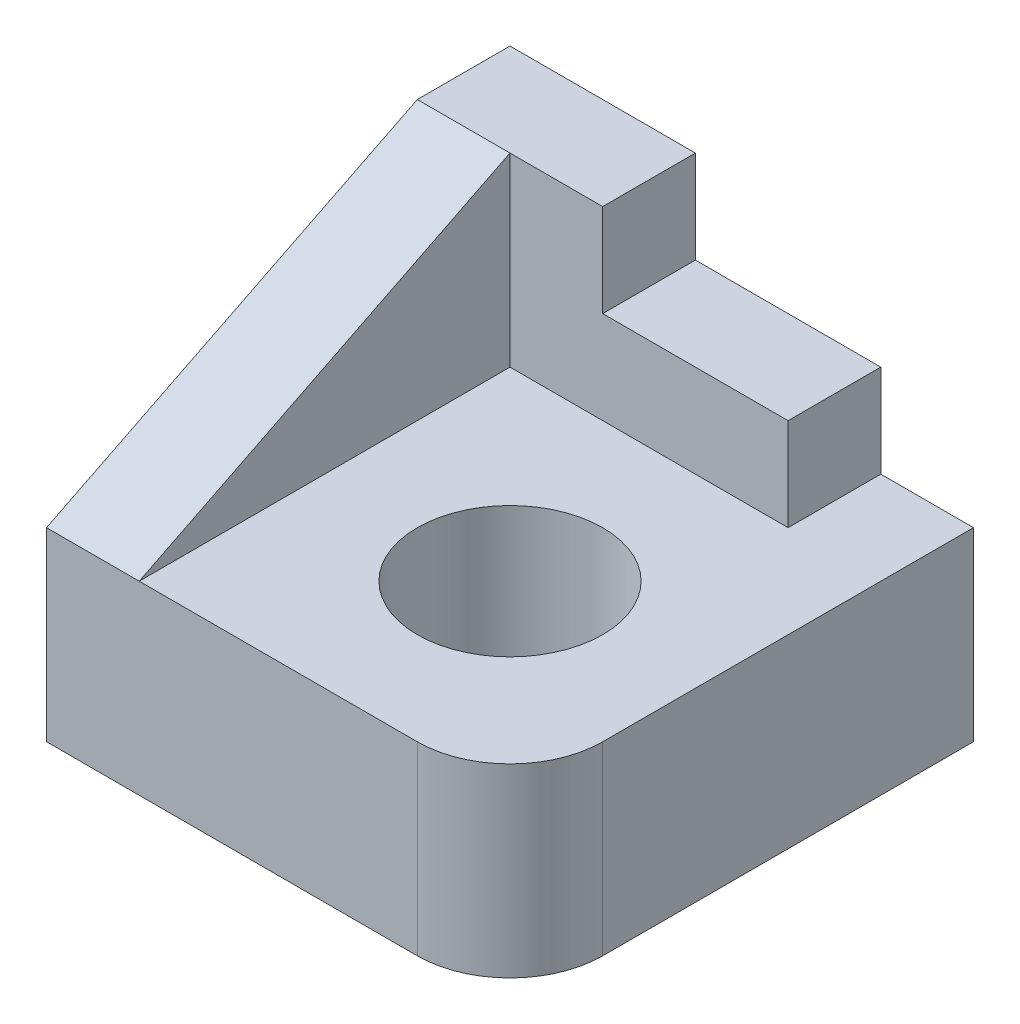
ISO-10303-21;
HEADER;
FILE_DESCRIPTION(('STEP AP214'),'2;1');
FILE_NAME('part.step','',(''),(''),'','','');
FILE_SCHEMA(('AUTOMOTIVE_DESIGN { 1 0 10303 214 1 1 1 1 }'));
ENDSEC;
DATA;
#1=APPLICATION_CONTEXT('core data for automotive mechanical design processes');
#2=APPLICATION_PROTOCOL_DEFINITION('international standard','automotive_design',2000,#1);
#3=PRODUCT_CONTEXT('',#1,'mechanical');
#4=PRODUCT('Part','Part','',(#3));
#5=PRODUCT_RELATED_PRODUCT_CATEGORY('part','',(#4));
#6=PRODUCT_DEFINITION_FORMATION('','',#4);
#7=PRODUCT_DEFINITION_CONTEXT('part definition',#1,'design');
#8=PRODUCT_DEFINITION('design','',#6,#7);
#9=PRODUCT_DEFINITION_SHAPE('','',#8);
#10=(LENGTH_UNIT() NAMED_UNIT(*) SI_UNIT(.MILLI.,.METRE.));
#11=(NAMED_UNIT(*) PLANE_ANGLE_UNIT() SI_UNIT($,.RADIAN.));
#12=(NAMED_UNIT(*) SI_UNIT($,.STERADIAN.) SOLID_ANGLE_UNIT());
#13=UNCERTAINTY_MEASURE_WITH_UNIT(LENGTH_MEASURE(1.E-05),#10,'distance_accuracy_value','');
#14=(GEOMETRIC_REPRESENTATION_CONTEXT(3) GLOBAL_UNCERTAINTY_ASSIGNED_CONTEXT((#13)) GLOBAL_UNIT_ASSIGNED_CONTEXT((#10,
#11,#12)) REPRESENTATION_CONTEXT('',''));
#15=CARTESIAN_POINT('',(0.,0.,0.));
#16=DIRECTION('',(0.,0.,1.));
#17=DIRECTION('',(1.,0.,0.));
#18=AXIS2_PLACEMENT_3D('',#15,#16,#17);
#19=CARTESIAN_POINT('',(20.,10.,20.));
#20=DIRECTION('',(0.,-1.,0.));
#21=DIRECTION('',(0.,0.,-1.));
#22=AXIS2_PLACEMENT_3D('',#19,#20,#21);
#23=PLANE('',#22);
#24=CARTESIAN_POINT('',(15.,10.,15.));
#25=DIRECTION('',(0.,1.,0.));
#26=DIRECTION('',(0.,0.,1.));
#27=AXIS2_PLACEMENT_3D('',#24,#25,#26);
#28=CIRCLE('',#27,5.);
#29=CARTESIAN_POINT('',(15.,10.,20.));
#30=VERTEX_POINT('',#29);
#31=EDGE_CURVE('E185',#30,#30,#28,.T.);
#32=ORIENTED_EDGE('',*,*,#31,.F.);
#33=EDGE_LOOP('',(#32));
#34=FACE_BOUND('',#33,.T.);
#35=DIRECTION('',(0.,0.,1.));
#36=VECTOR('',#35,1.);
#37=CARTESIAN_POINT('',(5.,10.,5.));
#38=LINE('',#37,#36);
#39=CARTESIAN_POINT('',(5.,10.,5.));
#40=VERTEX_POINT('',#39);
#41=CARTESIAN_POINT('',(5.,10.,25.));
#42=VERTEX_POINT('',#41);
#43=EDGE_CURVE('E131',#40,#42,#38,.T.);
#44=ORIENTED_EDGE('',*,*,#43,.T.);
#45=DIRECTION('',(1.,0.,0.));
#46=VECTOR('',#45,1.);
#47=CARTESIAN_POINT('',(0.,10.,25.));
#48=LINE('',#47,#46);
#49=CARTESIAN_POINT('',(20.,10.,25.));
#50=VERTEX_POINT('',#49);
#51=EDGE_CURVE('E85',#42,#50,#48,.T.);
#52=ORIENTED_EDGE('',*,*,#51,.T.);
#53=CARTESIAN_POINT('',(20.,10.,20.));
#54=DIRECTION('',(0.,1.,0.));
#55=DIRECTION('',(0.,0.,-1.));
#56=AXIS2_PLACEMENT_3D('',#53,#54,#55);
#57=CIRCLE('',#56,5.);
#58=CARTESIAN_POINT('',(25.,10.,20.));
#59=VERTEX_POINT('',#58);
#60=EDGE_CURVE('E192',#50,#59,#57,.T.);
#61=ORIENTED_EDGE('',*,*,#60,.T.);
#62=DIRECTION('',(0.,0.,-1.));
#63=VECTOR('',#62,1.);
#64=CARTESIAN_POINT('',(25.,10.,0.));
#65=LINE('',#64,#63);
#66=CARTESIAN_POINT('',(25.,10.,0.));
#67=VERTEX_POINT('',#66);
#68=EDGE_CURVE('E56',#59,#67,#65,.T.);
#69=ORIENTED_EDGE('',*,*,#68,.T.);
#70=DIRECTION('',(-1.,0.,0.));
#71=VECTOR('',#70,1.);
#72=CARTESIAN_POINT('',(0.,10.,0.));
#73=LINE('',#72,#71);
#74=CARTESIAN_POINT('',(20.,10.,0.));
#75=VERTEX_POINT('',#74);
#76=EDGE_CURVE('E50',#67,#75,#73,.T.);
#77=ORIENTED_EDGE('',*,*,#76,.T.);
#78=DIRECTION('',(0.,0.,-1.));
#79=VECTOR('',#78,1.);
#80=CARTESIAN_POINT('',(20.,10.,5.));
#81=LINE('',#80,#79);
#82=CARTESIAN_POINT('',(20.,10.,5.));
#83=VERTEX_POINT('',#82);
#84=EDGE_CURVE('E182',#83,#75,#81,.T.);
#85=ORIENTED_EDGE('',*,*,#84,.F.);
#86=DIRECTION('',(1.,0.,0.));
#87=VECTOR('',#86,1.);
#88=CARTESIAN_POINT('',(0.,10.,5.));
#89=LINE('',#88,#87);
#90=EDGE_CURVE('E154',#40,#83,#89,.T.);
#91=ORIENTED_EDGE('',*,*,#90,.F.);
#92=EDGE_LOOP('',(#44,#52,#61,#69,#77,#85,#91));
#93=FACE_BOUND('',#92,.T.);
#94=ADVANCED_FACE('F35',(#34,#93),#23,.F.);
#95=CARTESIAN_POINT('',(0.,0.,5.));
#96=DIRECTION('',(0.,0.,-1.));
#97=DIRECTION('',(-1.,0.,0.));
#98=AXIS2_PLACEMENT_3D('',#95,#96,#97);
#99=PLANE('',#98);
#100=DIRECTION('',(0.,-1.,0.));
#101=VECTOR('',#100,1.);
#102=CARTESIAN_POINT('',(5.,20.,5.));
#103=LINE('',#102,#101);
#104=CARTESIAN_POINT('',(5.,20.,5.));
#105=VERTEX_POINT('',#104);
#106=EDGE_CURVE('E127',#105,#40,#103,.T.);
#107=ORIENTED_EDGE('',*,*,#106,.T.);
#108=ORIENTED_EDGE('',*,*,#90,.T.);
#109=DIRECTION('',(0.,1.,0.));
#110=VECTOR('',#109,1.);
#111=CARTESIAN_POINT('',(20.,0.,5.));
#112=LINE('',#111,#110);
#113=CARTESIAN_POINT('',(20.,15.,5.));
#114=VERTEX_POINT('',#113);
#115=EDGE_CURVE('E234',#83,#114,#112,.T.);
#116=ORIENTED_EDGE('',*,*,#115,.T.);
#117=DIRECTION('',(1.,0.,0.));
#118=VECTOR('',#117,1.);
#119=CARTESIAN_POINT('',(0.,15.,5.));
#120=LINE('',#119,#118);
#121=CARTESIAN_POINT('',(10.,15.,5.));
#122=VERTEX_POINT('',#121);
#123=EDGE_CURVE('E235',#122,#114,#120,.T.);
#124=ORIENTED_EDGE('',*,*,#123,.F.);
#125=DIRECTION('',(0.,1.,0.));
#126=VECTOR('',#125,1.);
#127=CARTESIAN_POINT('',(10.,0.,5.));
#128=LINE('',#127,#126);
#129=CARTESIAN_POINT('',(10.,20.,5.));
#130=VERTEX_POINT('',#129);
#131=EDGE_CURVE('E151',#122,#130,#128,.T.);
#132=ORIENTED_EDGE('',*,*,#131,.T.);
#133=DIRECTION('',(1.,0.,0.));
#134=VECTOR('',#133,1.);
#135=CARTESIAN_POINT('',(0.,20.,5.));
#136=LINE('',#135,#134);
#137=EDGE_CURVE('E147',#105,#130,#136,.T.);
#138=ORIENTED_EDGE('',*,*,#137,.F.);
#139=EDGE_LOOP('',(#107,#108,#116,#124,#132,#138));
#140=FACE_BOUND('',#139,.T.);
#141=ADVANCED_FACE('F148',(#140),#99,.F.);
#142=CARTESIAN_POINT('',(20.,0.,20.));
#143=DIRECTION('',(0.,-1.,0.));
#144=DIRECTION('',(0.,0.,-1.));
#145=AXIS2_PLACEMENT_3D('',#142,#143,#144);
#146=PLANE('',#145);
#147=DIRECTION('',(0.,0.,1.));
#148=VECTOR('',#147,1.);
#149=CARTESIAN_POINT('',(0.,0.,0.));
#150=LINE('',#149,#148);
#151=CARTESIAN_POINT('',(0.,0.,0.));
#152=VERTEX_POINT('',#151);
#153=CARTESIAN_POINT('',(0.,0.,25.));
#154=VERTEX_POINT('',#153);
#155=EDGE_CURVE('E188',#152,#154,#150,.T.);
#156=ORIENTED_EDGE('',*,*,#155,.F.);
#157=DIRECTION('',(-1.,0.,0.));
#158=VECTOR('',#157,1.);
#159=CARTESIAN_POINT('',(0.,0.,0.));
#160=LINE('',#159,#158);
#161=CARTESIAN_POINT('',(25.,0.,0.));
#162=VERTEX_POINT('',#161);
#163=EDGE_CURVE('E80',#162,#152,#160,.T.);
#164=ORIENTED_EDGE('',*,*,#163,.F.);
#165=DIRECTION('',(0.,0.,-1.));
#166=VECTOR('',#165,1.);
#167=CARTESIAN_POINT('',(25.,0.,0.));
#168=LINE('',#167,#166);
#169=CARTESIAN_POINT('',(25.,0.,20.));
#170=VERTEX_POINT('',#169);
#171=EDGE_CURVE('E203',#170,#162,#168,.T.);
#172=ORIENTED_EDGE('',*,*,#171,.F.);
#173=CARTESIAN_POINT('',(20.,0.,20.));
#174=DIRECTION('',(0.,1.,0.));
#175=DIRECTION('',(0.,0.,-1.));
#176=AXIS2_PLACEMENT_3D('',#173,#174,#175);
#177=CIRCLE('',#176,5.);
#178=CARTESIAN_POINT('',(20.,0.,25.));
#179=VERTEX_POINT('',#178);
#180=EDGE_CURVE('E201',#179,#170,#177,.T.);
#181=ORIENTED_EDGE('',*,*,#180,.F.);
#182=DIRECTION('',(1.,0.,0.));
#183=VECTOR('',#182,1.);
#184=CARTESIAN_POINT('',(0.,0.,25.));
#185=LINE('',#184,#183);
#186=EDGE_CURVE('E199',#154,#179,#185,.T.);
#187=ORIENTED_EDGE('',*,*,#186,.F.);
#188=EDGE_LOOP('',(#156,#164,#172,#181,#187));
#189=FACE_BOUND('',#188,.T.);
#190=CARTESIAN_POINT('',(15.,0.,15.));
#191=DIRECTION('',(0.,1.,0.));
#192=DIRECTION('',(0.,0.,1.));
#193=AXIS2_PLACEMENT_3D('',#190,#191,#192);
#194=CIRCLE('',#193,5.);
#195=CARTESIAN_POINT('',(15.,0.,20.));
#196=VERTEX_POINT('',#195);
#197=EDGE_CURVE('E180',#196,#196,#194,.T.);
#198=ORIENTED_EDGE('',*,*,#197,.T.);
#199=EDGE_LOOP('',(#198));
#200=FACE_BOUND('',#199,.T.);
#201=ADVANCED_FACE('F221',(#189,#200),#146,.T.);
#202=CARTESIAN_POINT('',(0.,10.,0.));
#203=DIRECTION('',(1.,0.,0.));
#204=DIRECTION('',(0.,0.,-1.));
#205=AXIS2_PLACEMENT_3D('',#202,#203,#204);
#206=PLANE('',#205);
#207=DIRECTION('',(0.,-1.,0.));
#208=VECTOR('',#207,1.);
#209=CARTESIAN_POINT('',(0.,10.,25.));
#210=LINE('',#209,#208);
#211=CARTESIAN_POINT('',(0.,10.,25.));
#212=VERTEX_POINT('',#211);
#213=EDGE_CURVE('E11',#212,#154,#210,.T.);
#214=ORIENTED_EDGE('',*,*,#213,.F.);
#215=DIRECTION('',(0.,0.447213595499958,-0.894427190999916));
#216=VECTOR('',#215,1.);
#217=CARTESIAN_POINT('',(0.,10.,25.));
#218=LINE('',#217,#216);
#219=CARTESIAN_POINT('',(0.,20.,5.));
#220=VERTEX_POINT('',#219);
#221=EDGE_CURVE('E144',#212,#220,#218,.T.);
#222=ORIENTED_EDGE('',*,*,#221,.T.);
#223=DIRECTION('',(0.,0.,-1.));
#224=VECTOR('',#223,1.);
#225=CARTESIAN_POINT('',(0.,20.,5.));
#226=LINE('',#225,#224);
#227=CARTESIAN_POINT('',(0.,20.,0.));
#228=VERTEX_POINT('',#227);
#229=EDGE_CURVE('E159',#220,#228,#226,.T.);
#230=ORIENTED_EDGE('',*,*,#229,.T.);
#231=DIRECTION('',(0.,-1.,0.));
#232=VECTOR('',#231,1.);
#233=CARTESIAN_POINT('',(0.,10.,0.));
#234=LINE('',#233,#232);
#235=EDGE_CURVE('E196',#228,#152,#234,.T.);
#236=ORIENTED_EDGE('',*,*,#235,.T.);
#237=ORIENTED_EDGE('',*,*,#155,.T.);
#238=EDGE_LOOP('',(#214,#222,#230,#236,#237));
#239=FACE_BOUND('',#238,.T.);
#240=ADVANCED_FACE('F37',(#239),#206,.F.);
#241=CARTESIAN_POINT('',(0.,10.,25.));
#242=DIRECTION('',(0.,0.,-1.));
#243=DIRECTION('',(-1.,0.,0.));
#244=AXIS2_PLACEMENT_3D('',#241,#242,#243);
#245=PLANE('',#244);
#246=ORIENTED_EDGE('',*,*,#186,.T.);
#247=DIRECTION('',(0.,-1.,0.));
#248=VECTOR('',#247,1.);
#249=CARTESIAN_POINT('',(20.,10.,25.));
#250=LINE('',#249,#248);
#251=EDGE_CURVE('E43',#50,#179,#250,.T.);
#252=ORIENTED_EDGE('',*,*,#251,.F.);
#253=ORIENTED_EDGE('',*,*,#51,.F.);
#254=EDGE_CURVE('E143',#212,#42,#48,.T.);
#255=ORIENTED_EDGE('',*,*,#254,.F.);
#256=ORIENTED_EDGE('',*,*,#213,.T.);
#257=EDGE_LOOP('',(#246,#252,#253,#255,#256));
#258=FACE_BOUND('',#257,.T.);
#259=ADVANCED_FACE('F242',(#258),#245,.F.);
#260=CARTESIAN_POINT('',(20.,10.,20.));
#261=DIRECTION('',(0.,-1.,0.));
#262=DIRECTION('',(0.,0.,-1.));
#263=AXIS2_PLACEMENT_3D('',#260,#261,#262);
#264=CYLINDRICAL_SURFACE('',#263,5.);
#265=ORIENTED_EDGE('',*,*,#180,.T.);
#266=DIRECTION('',(0.,-1.,0.));
#267=VECTOR('',#266,1.);
#268=CARTESIAN_POINT('',(25.,10.,20.));
#269=LINE('',#268,#267);
#270=EDGE_CURVE('E209',#59,#170,#269,.T.);
#271=ORIENTED_EDGE('',*,*,#270,.F.);
#272=ORIENTED_EDGE('',*,*,#60,.F.);
#273=ORIENTED_EDGE('',*,*,#251,.T.);
#274=EDGE_LOOP('',(#265,#271,#272,#273));
#275=FACE_BOUND('',#274,.T.);
#276=ADVANCED_FACE('F215',(#275),#264,.T.);
#277=CARTESIAN_POINT('',(25.,10.,0.));
#278=DIRECTION('',(-1.,0.,0.));
#279=DIRECTION('',(0.,0.,1.));
#280=AXIS2_PLACEMENT_3D('',#277,#278,#279);
#281=PLANE('',#280);
#282=ORIENTED_EDGE('',*,*,#171,.T.);
#283=DIRECTION('',(0.,-1.,0.));
#284=VECTOR('',#283,1.);
#285=CARTESIAN_POINT('',(25.,10.,0.));
#286=LINE('',#285,#284);
#287=EDGE_CURVE('E207',#67,#162,#286,.T.);
#288=ORIENTED_EDGE('',*,*,#287,.F.);
#289=ORIENTED_EDGE('',*,*,#68,.F.);
#290=ORIENTED_EDGE('',*,*,#270,.T.);
#291=EDGE_LOOP('',(#282,#288,#289,#290));
#292=FACE_BOUND('',#291,.T.);
#293=ADVANCED_FACE('F224',(#292),#281,.F.);
#294=CARTESIAN_POINT('',(0.,10.,0.));
#295=DIRECTION('',(0.,0.,1.));
#296=DIRECTION('',(1.,0.,0.));
#297=AXIS2_PLACEMENT_3D('',#294,#295,#296);
#298=PLANE('',#297);
#299=ORIENTED_EDGE('',*,*,#163,.T.);
#300=ORIENTED_EDGE('',*,*,#235,.F.);
#301=DIRECTION('',(1.,0.,0.));
#302=VECTOR('',#301,1.);
#303=CARTESIAN_POINT('',(0.,20.,0.));
#304=LINE('',#303,#302);
#305=CARTESIAN_POINT('',(10.,20.,0.));
#306=VERTEX_POINT('',#305);
#307=EDGE_CURVE('E175',#228,#306,#304,.T.);
#308=ORIENTED_EDGE('',*,*,#307,.T.);
#309=DIRECTION('',(0.,1.,0.));
#310=VECTOR('',#309,1.);
#311=CARTESIAN_POINT('',(10.,0.,0.));
#312=LINE('',#311,#310);
#313=CARTESIAN_POINT('',(10.,15.,0.));
#314=VERTEX_POINT('',#313);
#315=EDGE_CURVE('E166',#314,#306,#312,.T.);
#316=ORIENTED_EDGE('',*,*,#315,.F.);
#317=DIRECTION('',(1.,0.,0.));
#318=VECTOR('',#317,1.);
#319=CARTESIAN_POINT('',(0.,15.,0.));
#320=LINE('',#319,#318);
#321=CARTESIAN_POINT('',(20.,15.,0.));
#322=VERTEX_POINT('',#321);
#323=EDGE_CURVE('E169',#314,#322,#320,.T.);
#324=ORIENTED_EDGE('',*,*,#323,.T.);
#325=DIRECTION('',(0.,1.,0.));
#326=VECTOR('',#325,1.);
#327=CARTESIAN_POINT('',(20.,0.,0.));
#328=LINE('',#327,#326);
#329=EDGE_CURVE('E172',#75,#322,#328,.T.);
#330=ORIENTED_EDGE('',*,*,#329,.F.);
#331=ORIENTED_EDGE('',*,*,#76,.F.);
#332=ORIENTED_EDGE('',*,*,#287,.T.);
#333=EDGE_LOOP('',(#299,#300,#308,#316,#324,#330,#331,#332));
#334=FACE_BOUND('',#333,.T.);
#335=ADVANCED_FACE('F225',(#334),#298,.F.);
#336=CARTESIAN_POINT('',(15.,10.,15.));
#337=DIRECTION('',(0.,-1.,0.));
#338=DIRECTION('',(0.,0.,-1.));
#339=AXIS2_PLACEMENT_3D('',#336,#337,#338);
#340=CYLINDRICAL_SURFACE('',#339,5.);
#341=ORIENTED_EDGE('',*,*,#31,.T.);
#342=EDGE_LOOP('',(#341));
#343=FACE_BOUND('',#342,.T.);
#344=ORIENTED_EDGE('',*,*,#197,.F.);
#345=EDGE_LOOP('',(#344));
#346=FACE_BOUND('',#345,.T.);
#347=ADVANCED_FACE('F266',(#343,#346),#340,.F.);
#348=CARTESIAN_POINT('',(10.,0.,5.));
#349=DIRECTION('',(-1.,0.,0.));
#350=DIRECTION('',(0.,0.,1.));
#351=AXIS2_PLACEMENT_3D('',#348,#349,#350);
#352=PLANE('',#351);
#353=ORIENTED_EDGE('',*,*,#315,.T.);
#354=DIRECTION('',(0.,0.,-1.));
#355=VECTOR('',#354,1.);
#356=CARTESIAN_POINT('',(10.,20.,5.));
#357=LINE('',#356,#355);
#358=EDGE_CURVE('E178',#130,#306,#357,.T.);
#359=ORIENTED_EDGE('',*,*,#358,.F.);
#360=ORIENTED_EDGE('',*,*,#131,.F.);
#361=DIRECTION('',(0.,0.,-1.));
#362=VECTOR('',#361,1.);
#363=CARTESIAN_POINT('',(10.,15.,5.));
#364=LINE('',#363,#362);
#365=EDGE_CURVE('E160',#122,#314,#364,.T.);
#366=ORIENTED_EDGE('',*,*,#365,.T.);
#367=EDGE_LOOP('',(#353,#359,#360,#366));
#368=FACE_BOUND('',#367,.T.);
#369=ADVANCED_FACE('F244',(#368),#352,.F.);
#370=CARTESIAN_POINT('',(0.,20.,5.));
#371=DIRECTION('',(0.,1.,0.));
#372=DIRECTION('',(0.,0.,1.));
#373=AXIS2_PLACEMENT_3D('',#370,#371,#372);
#374=PLANE('',#373);
#375=ORIENTED_EDGE('',*,*,#307,.F.);
#376=ORIENTED_EDGE('',*,*,#229,.F.);
#377=EDGE_CURVE('E140',#220,#105,#136,.T.);
#378=ORIENTED_EDGE('',*,*,#377,.T.);
#379=ORIENTED_EDGE('',*,*,#137,.T.);
#380=ORIENTED_EDGE('',*,*,#358,.T.);
#381=EDGE_LOOP('',(#375,#376,#378,#379,#380));
#382=FACE_BOUND('',#381,.T.);
#383=ADVANCED_FACE('F157',(#382),#374,.T.);
#384=CARTESIAN_POINT('',(20.,0.,5.));
#385=DIRECTION('',(-1.,0.,0.));
#386=DIRECTION('',(0.,0.,1.));
#387=AXIS2_PLACEMENT_3D('',#384,#385,#386);
#388=PLANE('',#387);
#389=ORIENTED_EDGE('',*,*,#329,.T.);
#390=DIRECTION('',(0.,0.,-1.));
#391=VECTOR('',#390,1.);
#392=CARTESIAN_POINT('',(20.,15.,5.));
#393=LINE('',#392,#391);
#394=EDGE_CURVE('E161',#114,#322,#393,.T.);
#395=ORIENTED_EDGE('',*,*,#394,.F.);
#396=ORIENTED_EDGE('',*,*,#115,.F.);
#397=ORIENTED_EDGE('',*,*,#84,.T.);
#398=EDGE_LOOP('',(#389,#395,#396,#397));
#399=FACE_BOUND('',#398,.T.);
#400=ADVANCED_FACE('F231',(#399),#388,.F.);
#401=CARTESIAN_POINT('',(0.,15.,5.));
#402=DIRECTION('',(0.,1.,0.));
#403=DIRECTION('',(-1.,0.,0.));
#404=AXIS2_PLACEMENT_3D('',#401,#402,#403);
#405=PLANE('',#404);
#406=ORIENTED_EDGE('',*,*,#323,.F.);
#407=ORIENTED_EDGE('',*,*,#365,.F.);
#408=ORIENTED_EDGE('',*,*,#123,.T.);
#409=ORIENTED_EDGE('',*,*,#394,.T.);
#410=EDGE_LOOP('',(#406,#407,#408,#409));
#411=FACE_BOUND('',#410,.T.);
#412=ADVANCED_FACE('F246',(#411),#405,.T.);
#413=CARTESIAN_POINT('',(5.,10.,25.));
#414=DIRECTION('',(0.,0.894427190999916,0.447213595499958));
#415=DIRECTION('',(0.,-0.447213595499958,0.894427190999916));
#416=AXIS2_PLACEMENT_3D('',#413,#414,#415);
#417=PLANE('',#416);
#418=ORIENTED_EDGE('',*,*,#221,.F.);
#419=ORIENTED_EDGE('',*,*,#254,.T.);
#420=DIRECTION('',(0.,0.447213595499958,-0.894427190999916));
#421=VECTOR('',#420,1.);
#422=CARTESIAN_POINT('',(5.,10.,25.));
#423=LINE('',#422,#421);
#424=EDGE_CURVE('E130',#42,#105,#423,.T.);
#425=ORIENTED_EDGE('',*,*,#424,.T.);
#426=ORIENTED_EDGE('',*,*,#377,.F.);
#427=EDGE_LOOP('',(#418,#419,#425,#426));
#428=FACE_BOUND('',#427,.T.);
#429=ADVANCED_FACE('F138',(#428),#417,.T.);
#430=CARTESIAN_POINT('',(5.,0.,0.));
#431=DIRECTION('',(-1.,0.,0.));
#432=DIRECTION('',(0.,0.,1.));
#433=AXIS2_PLACEMENT_3D('',#430,#431,#432);
#434=PLANE('',#433);
#435=ORIENTED_EDGE('',*,*,#424,.F.);
#436=ORIENTED_EDGE('',*,*,#43,.F.);
#437=ORIENTED_EDGE('',*,*,#106,.F.);
#438=EDGE_LOOP('',(#435,#436,#437));
#439=FACE_BOUND('',#438,.T.);
#440=ADVANCED_FACE('F129',(#439),#434,.F.);
#441=CLOSED_SHELL('',(#94,#141,#201,#240,#259,#276,#293,#335,#347,#369,#383,#400,#412,#429,#440));
#442=MANIFOLD_SOLID_BREP('B2',#441);
#443=ADVANCED_BREP_SHAPE_REPRESENTATION('',(#18,#442),#14);
#444=SHAPE_DEFINITION_REPRESENTATION(#9,#443);
ENDSEC;
END-ISO-10303-21;
